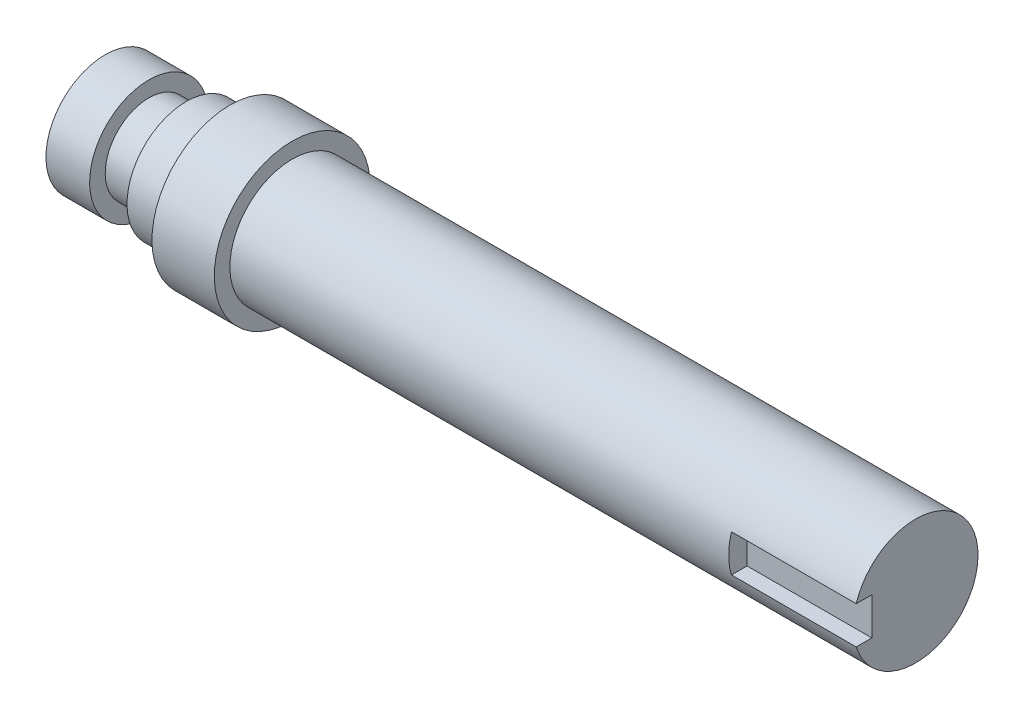
ISO-10303-21;
HEADER;
FILE_DESCRIPTION(('STEP AP214'),'2;1');
FILE_NAME('part.step','',(''),(''),'','','');
FILE_SCHEMA(('AUTOMOTIVE_DESIGN { 1 0 10303 214 1 1 1 1 }'));
ENDSEC;
DATA;
#1=APPLICATION_CONTEXT('core data for automotive mechanical design processes');
#2=APPLICATION_PROTOCOL_DEFINITION('international standard','automotive_design',2000,#1);
#3=PRODUCT_CONTEXT('',#1,'mechanical');
#4=PRODUCT('Part','Part','',(#3));
#5=PRODUCT_RELATED_PRODUCT_CATEGORY('part','',(#4));
#6=PRODUCT_DEFINITION_FORMATION('','',#4);
#7=PRODUCT_DEFINITION_CONTEXT('part definition',#1,'design');
#8=PRODUCT_DEFINITION('design','',#6,#7);
#9=PRODUCT_DEFINITION_SHAPE('','',#8);
#10=(LENGTH_UNIT() NAMED_UNIT(*) SI_UNIT(.MILLI.,.METRE.));
#11=(NAMED_UNIT(*) PLANE_ANGLE_UNIT() SI_UNIT($,.RADIAN.));
#12=(NAMED_UNIT(*) SI_UNIT($,.STERADIAN.) SOLID_ANGLE_UNIT());
#13=UNCERTAINTY_MEASURE_WITH_UNIT(LENGTH_MEASURE(1.E-05),#10,'distance_accuracy_value','');
#14=(GEOMETRIC_REPRESENTATION_CONTEXT(3) GLOBAL_UNCERTAINTY_ASSIGNED_CONTEXT((#13)) GLOBAL_UNIT_ASSIGNED_CONTEXT((#10,
#11,#12)) REPRESENTATION_CONTEXT('',''));
#15=CARTESIAN_POINT('',(0.,0.,0.));
#16=DIRECTION('',(0.,0.,1.));
#17=DIRECTION('',(1.,0.,0.));
#18=AXIS2_PLACEMENT_3D('',#15,#16,#17);
#19=CARTESIAN_POINT('',(130.,0.,0.));
#20=DIRECTION('',(1.,0.,0.));
#21=DIRECTION('',(0.,1.,0.));
#22=AXIS2_PLACEMENT_3D('',#19,#20,#21);
#23=CYLINDRICAL_SURFACE('',#22,10.);
#24=CARTESIAN_POINT('',(30.,0.,0.));
#25=DIRECTION('',(1.,0.,0.));
#26=DIRECTION('',(0.,1.,0.));
#27=AXIS2_PLACEMENT_3D('',#24,#25,#26);
#28=CIRCLE('',#27,10.);
#29=CARTESIAN_POINT('',(30.,10.,0.));
#30=VERTEX_POINT('',#29);
#31=EDGE_CURVE('E116',#30,#30,#28,.T.);
#32=ORIENTED_EDGE('',*,*,#31,.T.);
#33=EDGE_LOOP('',(#32));
#34=FACE_BOUND('',#33,.T.);
#35=CARTESIAN_POINT('',(110.,0.,0.));
#36=DIRECTION('',(1.,0.,0.));
#37=DIRECTION('',(0.,1.,0.));
#38=AXIS2_PLACEMENT_3D('',#35,#36,#37);
#39=CIRCLE('',#38,10.);
#40=CARTESIAN_POINT('',(110.,3.00000000000001,9.53939201416946));
#41=VERTEX_POINT('',#40);
#42=CARTESIAN_POINT('',(110.,-2.99999999999999,9.53939201416946));
#43=VERTEX_POINT('',#42);
#44=EDGE_CURVE('E105',#41,#43,#39,.T.);
#45=ORIENTED_EDGE('',*,*,#44,.F.);
#46=DIRECTION('',(1.,0.,0.));
#47=VECTOR('',#46,1.);
#48=CARTESIAN_POINT('',(110.,3.00000000000001,9.53939201416946));
#49=LINE('',#48,#47);
#50=CARTESIAN_POINT('',(130.,3.00000000000001,9.53939201416946));
#51=VERTEX_POINT('',#50);
#52=EDGE_CURVE('E64',#41,#51,#49,.T.);
#53=ORIENTED_EDGE('',*,*,#52,.T.);
#54=CARTESIAN_POINT('',(130.,0.,0.));
#55=DIRECTION('',(1.,0.,0.));
#56=DIRECTION('',(0.,1.,0.));
#57=AXIS2_PLACEMENT_3D('',#54,#55,#56);
#58=CIRCLE('',#57,10.);
#59=CARTESIAN_POINT('',(130.,-2.99999999999999,9.53939201416946));
#60=VERTEX_POINT('',#59);
#61=EDGE_CURVE('E111',#60,#51,#58,.T.);
#62=ORIENTED_EDGE('',*,*,#61,.F.);
#63=DIRECTION('',(1.,0.,0.));
#64=VECTOR('',#63,1.);
#65=CARTESIAN_POINT('',(110.,-2.99999999999999,9.53939201416946));
#66=LINE('',#65,#64);
#67=EDGE_CURVE('E95',#43,#60,#66,.T.);
#68=ORIENTED_EDGE('',*,*,#67,.F.);
#69=EDGE_LOOP('',(#45,#53,#62,#68));
#70=FACE_BOUND('',#69,.T.);
#71=ADVANCED_FACE('F41',(#34,#70),#23,.T.);
#72=CARTESIAN_POINT('',(0.,0.,0.));
#73=DIRECTION('',(-1.,0.,0.));
#74=DIRECTION('',(0.,-1.,0.));
#75=AXIS2_PLACEMENT_3D('',#72,#73,#74);
#76=PLANE('',#75);
#77=CARTESIAN_POINT('',(0.,0.,0.));
#78=DIRECTION('',(1.,0.,0.));
#79=DIRECTION('',(0.,1.,0.));
#80=AXIS2_PLACEMENT_3D('',#77,#78,#79);
#81=CIRCLE('',#80,9.5);
#82=CARTESIAN_POINT('',(0.,9.5,0.));
#83=VERTEX_POINT('',#82);
#84=EDGE_CURVE('E11',#83,#83,#81,.T.);
#85=ORIENTED_EDGE('',*,*,#84,.F.);
#86=EDGE_LOOP('',(#85));
#87=FACE_BOUND('',#86,.T.);
#88=ADVANCED_FACE('F43',(#87),#76,.T.);
#89=CARTESIAN_POINT('',(130.,0.,0.));
#90=DIRECTION('',(1.,0.,0.));
#91=DIRECTION('',(0.,1.,0.));
#92=AXIS2_PLACEMENT_3D('',#89,#90,#91);
#93=CYLINDRICAL_SURFACE('',#92,9.5);
#94=ORIENTED_EDGE('',*,*,#84,.T.);
#95=EDGE_LOOP('',(#94));
#96=FACE_BOUND('',#95,.T.);
#97=CARTESIAN_POINT('',(7.00000000000001,0.,0.));
#98=DIRECTION('',(1.,0.,0.));
#99=DIRECTION('',(0.,1.,0.));
#100=AXIS2_PLACEMENT_3D('',#97,#98,#99);
#101=CIRCLE('',#100,9.5);
#102=CARTESIAN_POINT('',(7.00000000000001,9.5,0.));
#103=VERTEX_POINT('',#102);
#104=EDGE_CURVE('E47',#103,#103,#101,.T.);
#105=ORIENTED_EDGE('',*,*,#104,.F.);
#106=EDGE_LOOP('',(#105));
#107=FACE_BOUND('',#106,.T.);
#108=ADVANCED_FACE('F143',(#96,#107),#93,.T.);
#109=CARTESIAN_POINT('',(7.,9.5,0.));
#110=DIRECTION('',(1.,0.,0.));
#111=DIRECTION('',(0.,1.,0.));
#112=AXIS2_PLACEMENT_3D('',#109,#110,#111);
#113=PLANE('',#112);
#114=ORIENTED_EDGE('',*,*,#104,.T.);
#115=EDGE_LOOP('',(#114));
#116=FACE_BOUND('',#115,.T.);
#117=CARTESIAN_POINT('',(7.00000000000001,0.,0.));
#118=DIRECTION('',(1.,0.,0.));
#119=DIRECTION('',(0.,1.,0.));
#120=AXIS2_PLACEMENT_3D('',#117,#118,#119);
#121=CIRCLE('',#120,6.99999999999998);
#122=CARTESIAN_POINT('',(7.00000000000001,6.99999999999998,0.));
#123=VERTEX_POINT('',#122);
#124=EDGE_CURVE('E136',#123,#123,#121,.T.);
#125=ORIENTED_EDGE('',*,*,#124,.F.);
#126=EDGE_LOOP('',(#125));
#127=FACE_BOUND('',#126,.T.);
#128=ADVANCED_FACE('F141',(#116,#127),#113,.T.);
#129=CARTESIAN_POINT('',(130.,0.,0.));
#130=DIRECTION('',(1.,0.,0.));
#131=DIRECTION('',(0.,1.,0.));
#132=AXIS2_PLACEMENT_3D('',#129,#130,#131);
#133=CYLINDRICAL_SURFACE('',#132,6.99999999999998);
#134=ORIENTED_EDGE('',*,*,#124,.T.);
#135=EDGE_LOOP('',(#134));
#136=FACE_BOUND('',#135,.T.);
#137=CARTESIAN_POINT('',(13.,0.,0.));
#138=DIRECTION('',(1.,0.,0.));
#139=DIRECTION('',(0.,1.,0.));
#140=AXIS2_PLACEMENT_3D('',#137,#138,#139);
#141=CIRCLE('',#140,6.99999999999998);
#142=CARTESIAN_POINT('',(13.,6.99999999999998,0.));
#143=VERTEX_POINT('',#142);
#144=EDGE_CURVE('E133',#143,#143,#141,.T.);
#145=ORIENTED_EDGE('',*,*,#144,.F.);
#146=EDGE_LOOP('',(#145));
#147=FACE_BOUND('',#146,.T.);
#148=ADVANCED_FACE('F153',(#136,#147),#133,.T.);
#149=CARTESIAN_POINT('',(13.,6.99999999999998,0.));
#150=DIRECTION('',(-1.,0.,0.));
#151=DIRECTION('',(0.,-1.,0.));
#152=AXIS2_PLACEMENT_3D('',#149,#150,#151);
#153=PLANE('',#152);
#154=ORIENTED_EDGE('',*,*,#144,.T.);
#155=EDGE_LOOP('',(#154));
#156=FACE_BOUND('',#155,.T.);
#157=CARTESIAN_POINT('',(13.,0.,0.));
#158=DIRECTION('',(1.,0.,0.));
#159=DIRECTION('',(0.,1.,0.));
#160=AXIS2_PLACEMENT_3D('',#157,#158,#159);
#161=CIRCLE('',#160,9.5);
#162=CARTESIAN_POINT('',(13.,9.5,0.));
#163=VERTEX_POINT('',#162);
#164=EDGE_CURVE('E127',#163,#163,#161,.T.);
#165=ORIENTED_EDGE('',*,*,#164,.F.);
#166=EDGE_LOOP('',(#165));
#167=FACE_BOUND('',#166,.T.);
#168=ADVANCED_FACE('F179',(#156,#167),#153,.T.);
#169=CARTESIAN_POINT('',(130.,0.,0.));
#170=DIRECTION('',(1.,0.,0.));
#171=DIRECTION('',(0.,1.,0.));
#172=AXIS2_PLACEMENT_3D('',#169,#170,#171);
#173=CYLINDRICAL_SURFACE('',#172,9.5);
#174=ORIENTED_EDGE('',*,*,#164,.T.);
#175=EDGE_LOOP('',(#174));
#176=FACE_BOUND('',#175,.T.);
#177=CARTESIAN_POINT('',(20.,0.,0.));
#178=DIRECTION('',(1.,0.,0.));
#179=DIRECTION('',(0.,1.,0.));
#180=AXIS2_PLACEMENT_3D('',#177,#178,#179);
#181=CIRCLE('',#180,9.5);
#182=CARTESIAN_POINT('',(20.,9.5,0.));
#183=VERTEX_POINT('',#182);
#184=EDGE_CURVE('E130',#183,#183,#181,.T.);
#185=ORIENTED_EDGE('',*,*,#184,.F.);
#186=EDGE_LOOP('',(#185));
#187=FACE_BOUND('',#186,.T.);
#188=ADVANCED_FACE('F176',(#176,#187),#173,.T.);
#189=CARTESIAN_POINT('',(20.,9.5,0.));
#190=DIRECTION('',(-1.,0.,0.));
#191=DIRECTION('',(0.,-1.,0.));
#192=AXIS2_PLACEMENT_3D('',#189,#190,#191);
#193=PLANE('',#192);
#194=ORIENTED_EDGE('',*,*,#184,.T.);
#195=EDGE_LOOP('',(#194));
#196=FACE_BOUND('',#195,.T.);
#197=CARTESIAN_POINT('',(20.,0.,0.));
#198=DIRECTION('',(1.,0.,0.));
#199=DIRECTION('',(0.,1.,0.));
#200=AXIS2_PLACEMENT_3D('',#197,#198,#199);
#201=CIRCLE('',#200,12.5);
#202=CARTESIAN_POINT('',(20.,12.5,0.));
#203=VERTEX_POINT('',#202);
#204=EDGE_CURVE('E125',#203,#203,#201,.T.);
#205=ORIENTED_EDGE('',*,*,#204,.F.);
#206=EDGE_LOOP('',(#205));
#207=FACE_BOUND('',#206,.T.);
#208=ADVANCED_FACE('F175',(#196,#207),#193,.T.);
#209=CARTESIAN_POINT('',(130.,0.,0.));
#210=DIRECTION('',(1.,0.,0.));
#211=DIRECTION('',(0.,1.,0.));
#212=AXIS2_PLACEMENT_3D('',#209,#210,#211);
#213=CYLINDRICAL_SURFACE('',#212,12.5);
#214=ORIENTED_EDGE('',*,*,#204,.T.);
#215=EDGE_LOOP('',(#214));
#216=FACE_BOUND('',#215,.T.);
#217=CARTESIAN_POINT('',(30.,0.,0.));
#218=DIRECTION('',(1.,0.,0.));
#219=DIRECTION('',(0.,1.,0.));
#220=AXIS2_PLACEMENT_3D('',#217,#218,#219);
#221=CIRCLE('',#220,12.5);
#222=CARTESIAN_POINT('',(30.,12.5,0.));
#223=VERTEX_POINT('',#222);
#224=EDGE_CURVE('E123',#223,#223,#221,.T.);
#225=ORIENTED_EDGE('',*,*,#224,.F.);
#226=EDGE_LOOP('',(#225));
#227=FACE_BOUND('',#226,.T.);
#228=ADVANCED_FACE('F166',(#216,#227),#213,.T.);
#229=CARTESIAN_POINT('',(30.,12.5,0.));
#230=DIRECTION('',(1.,0.,0.));
#231=DIRECTION('',(0.,1.,0.));
#232=AXIS2_PLACEMENT_3D('',#229,#230,#231);
#233=PLANE('',#232);
#234=ORIENTED_EDGE('',*,*,#224,.T.);
#235=EDGE_LOOP('',(#234));
#236=FACE_BOUND('',#235,.T.);
#237=ORIENTED_EDGE('',*,*,#31,.F.);
#238=EDGE_LOOP('',(#237));
#239=FACE_BOUND('',#238,.T.);
#240=ADVANCED_FACE('F168',(#236,#239),#233,.T.);
#241=CARTESIAN_POINT('',(130.,10.,0.));
#242=DIRECTION('',(1.,0.,0.));
#243=DIRECTION('',(0.,1.,0.));
#244=AXIS2_PLACEMENT_3D('',#241,#242,#243);
#245=PLANE('',#244);
#246=DIRECTION('',(0.,0.,-1.));
#247=VECTOR('',#246,1.);
#248=CARTESIAN_POINT('',(130.,-2.99999999999999,9.53939201416946));
#249=LINE('',#248,#247);
#250=CARTESIAN_POINT('',(130.,-2.99999999999999,7.03939201416946));
#251=VERTEX_POINT('',#250);
#252=EDGE_CURVE('E57',#60,#251,#249,.T.);
#253=ORIENTED_EDGE('',*,*,#252,.F.);
#254=ORIENTED_EDGE('',*,*,#61,.T.);
#255=DIRECTION('',(0.,0.,1.));
#256=VECTOR('',#255,1.);
#257=CARTESIAN_POINT('',(130.,3.00000000000001,9.53939201416946));
#258=LINE('',#257,#256);
#259=CARTESIAN_POINT('',(130.,3.00000000000001,7.03939201416946));
#260=VERTEX_POINT('',#259);
#261=EDGE_CURVE('E80',#260,#51,#258,.T.);
#262=ORIENTED_EDGE('',*,*,#261,.F.);
#263=DIRECTION('',(0.,1.,0.));
#264=VECTOR('',#263,1.);
#265=CARTESIAN_POINT('',(130.,3.00000000000001,7.03939201416946));
#266=LINE('',#265,#264);
#267=EDGE_CURVE('E107',#251,#260,#266,.T.);
#268=ORIENTED_EDGE('',*,*,#267,.F.);
#269=EDGE_LOOP('',(#253,#254,#262,#268));
#270=FACE_BOUND('',#269,.T.);
#271=ADVANCED_FACE('F162',(#270),#245,.T.);
#272=CARTESIAN_POINT('',(110.,3.00000000000001,9.53939201416946));
#273=DIRECTION('',(0.,1.,0.));
#274=DIRECTION('',(-1.,0.,0.));
#275=AXIS2_PLACEMENT_3D('',#272,#273,#274);
#276=PLANE('',#275);
#277=ORIENTED_EDGE('',*,*,#261,.T.);
#278=ORIENTED_EDGE('',*,*,#52,.F.);
#279=DIRECTION('',(0.,0.,1.));
#280=VECTOR('',#279,1.);
#281=CARTESIAN_POINT('',(110.,3.00000000000001,9.53939201416946));
#282=LINE('',#281,#280);
#283=CARTESIAN_POINT('',(110.,3.00000000000001,7.03939201416946));
#284=VERTEX_POINT('',#283);
#285=EDGE_CURVE('E97',#284,#41,#282,.T.);
#286=ORIENTED_EDGE('',*,*,#285,.F.);
#287=DIRECTION('',(1.,0.,0.));
#288=VECTOR('',#287,1.);
#289=CARTESIAN_POINT('',(110.,3.00000000000001,7.03939201416946));
#290=LINE('',#289,#288);
#291=EDGE_CURVE('E91',#284,#260,#290,.T.);
#292=ORIENTED_EDGE('',*,*,#291,.T.);
#293=EDGE_LOOP('',(#277,#278,#286,#292));
#294=FACE_BOUND('',#293,.T.);
#295=ADVANCED_FACE('F239',(#294),#276,.F.);
#296=CARTESIAN_POINT('',(110.,3.00000000000001,7.03939201416946));
#297=DIRECTION('',(0.,0.,-1.));
#298=DIRECTION('',(-1.,0.,0.));
#299=AXIS2_PLACEMENT_3D('',#296,#297,#298);
#300=PLANE('',#299);
#301=ORIENTED_EDGE('',*,*,#267,.T.);
#302=ORIENTED_EDGE('',*,*,#291,.F.);
#303=DIRECTION('',(0.,1.,0.));
#304=VECTOR('',#303,1.);
#305=CARTESIAN_POINT('',(110.,3.00000000000001,7.03939201416946));
#306=LINE('',#305,#304);
#307=CARTESIAN_POINT('',(110.,-2.99999999999999,7.03939201416946));
#308=VERTEX_POINT('',#307);
#309=EDGE_CURVE('E94',#308,#284,#306,.T.);
#310=ORIENTED_EDGE('',*,*,#309,.F.);
#311=DIRECTION('',(1.,0.,0.));
#312=VECTOR('',#311,1.);
#313=CARTESIAN_POINT('',(110.,-2.99999999999999,7.03939201416946));
#314=LINE('',#313,#312);
#315=EDGE_CURVE('E82',#308,#251,#314,.T.);
#316=ORIENTED_EDGE('',*,*,#315,.T.);
#317=EDGE_LOOP('',(#301,#302,#310,#316));
#318=FACE_BOUND('',#317,.T.);
#319=ADVANCED_FACE('F96',(#318),#300,.F.);
#320=CARTESIAN_POINT('',(110.,-2.99999999999999,9.53939201416946));
#321=DIRECTION('',(0.,-1.,0.));
#322=DIRECTION('',(1.,0.,0.));
#323=AXIS2_PLACEMENT_3D('',#320,#321,#322);
#324=PLANE('',#323);
#325=ORIENTED_EDGE('',*,*,#252,.T.);
#326=ORIENTED_EDGE('',*,*,#315,.F.);
#327=DIRECTION('',(0.,0.,-1.));
#328=VECTOR('',#327,1.);
#329=CARTESIAN_POINT('',(110.,-2.99999999999999,9.53939201416946));
#330=LINE('',#329,#328);
#331=EDGE_CURVE('E81',#43,#308,#330,.T.);
#332=ORIENTED_EDGE('',*,*,#331,.F.);
#333=ORIENTED_EDGE('',*,*,#67,.T.);
#334=EDGE_LOOP('',(#325,#326,#332,#333));
#335=FACE_BOUND('',#334,.T.);
#336=ADVANCED_FACE('F90',(#335),#324,.F.);
#337=CARTESIAN_POINT('',(110.,0.,0.));
#338=DIRECTION('',(1.,0.,0.));
#339=DIRECTION('',(0.,1.,0.));
#340=AXIS2_PLACEMENT_3D('',#337,#338,#339);
#341=PLANE('',#340);
#342=ORIENTED_EDGE('',*,*,#44,.T.);
#343=ORIENTED_EDGE('',*,*,#331,.T.);
#344=ORIENTED_EDGE('',*,*,#309,.T.);
#345=ORIENTED_EDGE('',*,*,#285,.T.);
#346=EDGE_LOOP('',(#342,#343,#344,#345));
#347=FACE_BOUND('',#346,.T.);
#348=ADVANCED_FACE('F99',(#347),#341,.T.);
#349=CLOSED_SHELL('',(#71,#88,#108,#128,#148,#168,#188,#208,#228,#240,#271,#295,#319,#336,#348));
#350=MANIFOLD_SOLID_BREP('B2',#349);
#351=ADVANCED_BREP_SHAPE_REPRESENTATION('',(#18,#350),#14);
#352=SHAPE_DEFINITION_REPRESENTATION(#9,#351);
ENDSEC;
END-ISO-10303-21;
